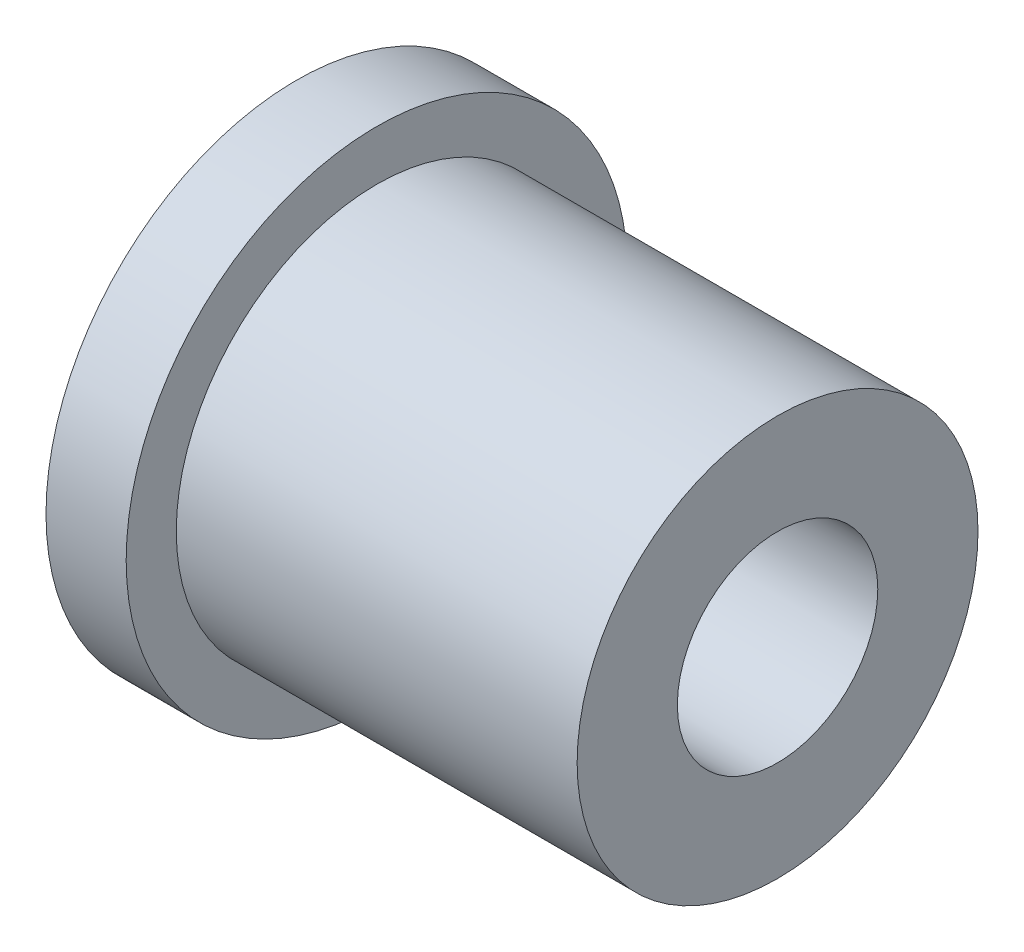
ISO-10303-21;
HEADER;
FILE_DESCRIPTION(('STEP AP214'),'2;1');
FILE_NAME('part.step','',(''),(''),'','','');
FILE_SCHEMA(('AUTOMOTIVE_DESIGN { 1 0 10303 214 1 1 1 1 }'));
ENDSEC;
DATA;
#1=APPLICATION_CONTEXT('core data for automotive mechanical design processes');
#2=APPLICATION_PROTOCOL_DEFINITION('international standard','automotive_design',2000,#1);
#3=PRODUCT_CONTEXT('',#1,'mechanical');
#4=PRODUCT('Part','Part','',(#3));
#5=PRODUCT_RELATED_PRODUCT_CATEGORY('part','',(#4));
#6=PRODUCT_DEFINITION_FORMATION('','',#4);
#7=PRODUCT_DEFINITION_CONTEXT('part definition',#1,'design');
#8=PRODUCT_DEFINITION('design','',#6,#7);
#9=PRODUCT_DEFINITION_SHAPE('','',#8);
#10=(LENGTH_UNIT() NAMED_UNIT(*) SI_UNIT(.MILLI.,.METRE.));
#11=(NAMED_UNIT(*) PLANE_ANGLE_UNIT() SI_UNIT($,.RADIAN.));
#12=(NAMED_UNIT(*) SI_UNIT($,.STERADIAN.) SOLID_ANGLE_UNIT());
#13=UNCERTAINTY_MEASURE_WITH_UNIT(LENGTH_MEASURE(1.E-05),#10,'distance_accuracy_value','');
#14=(GEOMETRIC_REPRESENTATION_CONTEXT(3) GLOBAL_UNCERTAINTY_ASSIGNED_CONTEXT((#13)) GLOBAL_UNIT_ASSIGNED_CONTEXT((#10,
#11,#12)) REPRESENTATION_CONTEXT('',''));
#15=CARTESIAN_POINT('',(0.,0.,0.));
#16=DIRECTION('',(0.,0.,1.));
#17=DIRECTION('',(1.,0.,0.));
#18=AXIS2_PLACEMENT_3D('',#15,#16,#17);
#19=CARTESIAN_POINT('',(0.,0.,0.));
#20=DIRECTION('',(-1.,0.,0.));
#21=DIRECTION('',(0.,0.,1.));
#22=AXIS2_PLACEMENT_3D('',#19,#20,#21);
#23=CYLINDRICAL_SURFACE('',#22,7.9375);
#24=CARTESIAN_POINT('',(0.,0.,0.));
#25=DIRECTION('',(-1.,0.,0.));
#26=DIRECTION('',(0.,0.,1.));
#27=AXIS2_PLACEMENT_3D('',#24,#25,#26);
#28=CIRCLE('',#27,7.9375);
#29=CARTESIAN_POINT('',(0.,0.,7.9375));
#30=VERTEX_POINT('',#29);
#31=EDGE_CURVE('E70',#30,#30,#28,.T.);
#32=ORIENTED_EDGE('',*,*,#31,.F.);
#33=EDGE_LOOP('',(#32));
#34=FACE_BOUND('',#33,.T.);
#35=CARTESIAN_POINT('',(2.54,0.,0.));
#36=DIRECTION('',(-1.,0.,0.));
#37=DIRECTION('',(0.,0.,1.));
#38=AXIS2_PLACEMENT_3D('',#35,#36,#37);
#39=CIRCLE('',#38,7.9375);
#40=CARTESIAN_POINT('',(2.54,0.,7.9375));
#41=VERTEX_POINT('',#40);
#42=EDGE_CURVE('E10',#41,#41,#39,.T.);
#43=ORIENTED_EDGE('',*,*,#42,.T.);
#44=EDGE_LOOP('',(#43));
#45=FACE_BOUND('',#44,.T.);
#46=ADVANCED_FACE('F43',(#34,#45),#23,.T.);
#47=CARTESIAN_POINT('',(2.54,7.9375,0.));
#48=DIRECTION('',(-1.,0.,0.));
#49=DIRECTION('',(0.,0.,1.));
#50=AXIS2_PLACEMENT_3D('',#47,#48,#49);
#51=PLANE('',#50);
#52=ORIENTED_EDGE('',*,*,#42,.F.);
#53=EDGE_LOOP('',(#52));
#54=FACE_BOUND('',#53,.T.);
#55=CARTESIAN_POINT('',(2.54,0.,0.));
#56=DIRECTION('',(-1.,0.,0.));
#57=DIRECTION('',(0.,0.,1.));
#58=AXIS2_PLACEMENT_3D('',#55,#56,#57);
#59=CIRCLE('',#58,6.35);
#60=CARTESIAN_POINT('',(2.54,0.,6.35));
#61=VERTEX_POINT('',#60);
#62=EDGE_CURVE('E50',#61,#61,#59,.T.);
#63=ORIENTED_EDGE('',*,*,#62,.T.);
#64=EDGE_LOOP('',(#63));
#65=FACE_BOUND('',#64,.T.);
#66=ADVANCED_FACE('F78',(#54,#65),#51,.F.);
#67=CARTESIAN_POINT('',(0.,0.,0.));
#68=DIRECTION('',(-1.,0.,0.));
#69=DIRECTION('',(0.,0.,1.));
#70=AXIS2_PLACEMENT_3D('',#67,#68,#69);
#71=CYLINDRICAL_SURFACE('',#70,6.35);
#72=ORIENTED_EDGE('',*,*,#62,.F.);
#73=EDGE_LOOP('',(#72));
#74=FACE_BOUND('',#73,.T.);
#75=CARTESIAN_POINT('',(15.24,0.,0.));
#76=DIRECTION('',(-1.,0.,0.));
#77=DIRECTION('',(0.,0.,1.));
#78=AXIS2_PLACEMENT_3D('',#75,#76,#77);
#79=CIRCLE('',#78,6.35);
#80=CARTESIAN_POINT('',(15.24,0.,6.35));
#81=VERTEX_POINT('',#80);
#82=EDGE_CURVE('E55',#81,#81,#79,.T.);
#83=ORIENTED_EDGE('',*,*,#82,.T.);
#84=EDGE_LOOP('',(#83));
#85=FACE_BOUND('',#84,.T.);
#86=ADVANCED_FACE('F82',(#74,#85),#71,.T.);
#87=CARTESIAN_POINT('',(15.24,6.35,0.));
#88=DIRECTION('',(-1.,0.,0.));
#89=DIRECTION('',(0.,0.,1.));
#90=AXIS2_PLACEMENT_3D('',#87,#88,#89);
#91=PLANE('',#90);
#92=ORIENTED_EDGE('',*,*,#82,.F.);
#93=EDGE_LOOP('',(#92));
#94=FACE_BOUND('',#93,.T.);
#95=CARTESIAN_POINT('',(15.24,0.,0.));
#96=DIRECTION('',(-1.,0.,0.));
#97=DIRECTION('',(0.,0.,1.));
#98=AXIS2_PLACEMENT_3D('',#95,#96,#97);
#99=CIRCLE('',#98,3.175);
#100=CARTESIAN_POINT('',(15.24,0.,3.175));
#101=VERTEX_POINT('',#100);
#102=EDGE_CURVE('E60',#101,#101,#99,.T.);
#103=ORIENTED_EDGE('',*,*,#102,.T.);
#104=EDGE_LOOP('',(#103));
#105=FACE_BOUND('',#104,.T.);
#106=ADVANCED_FACE('F87',(#94,#105),#91,.F.);
#107=CARTESIAN_POINT('',(0.,0.,0.));
#108=DIRECTION('',(-1.,0.,0.));
#109=DIRECTION('',(0.,0.,1.));
#110=AXIS2_PLACEMENT_3D('',#107,#108,#109);
#111=CYLINDRICAL_SURFACE('',#110,3.175);
#112=ORIENTED_EDGE('',*,*,#102,.F.);
#113=EDGE_LOOP('',(#112));
#114=FACE_BOUND('',#113,.T.);
#115=CARTESIAN_POINT('',(0.,0.,0.));
#116=DIRECTION('',(-1.,0.,0.));
#117=DIRECTION('',(0.,0.,1.));
#118=AXIS2_PLACEMENT_3D('',#115,#116,#117);
#119=CIRCLE('',#118,3.175);
#120=CARTESIAN_POINT('',(0.,0.,3.175));
#121=VERTEX_POINT('',#120);
#122=EDGE_CURVE('E66',#121,#121,#119,.T.);
#123=ORIENTED_EDGE('',*,*,#122,.T.);
#124=EDGE_LOOP('',(#123));
#125=FACE_BOUND('',#124,.T.);
#126=ADVANCED_FACE('F93',(#114,#125),#111,.F.);
#127=CARTESIAN_POINT('',(0.,3.175,0.));
#128=DIRECTION('',(1.,0.,0.));
#129=DIRECTION('',(0.,0.,-1.));
#130=AXIS2_PLACEMENT_3D('',#127,#128,#129);
#131=PLANE('',#130);
#132=ORIENTED_EDGE('',*,*,#122,.F.);
#133=EDGE_LOOP('',(#132));
#134=FACE_BOUND('',#133,.T.);
#135=ORIENTED_EDGE('',*,*,#31,.T.);
#136=EDGE_LOOP('',(#135));
#137=FACE_BOUND('',#136,.T.);
#138=ADVANCED_FACE('F75',(#134,#137),#131,.F.);
#139=CLOSED_SHELL('',(#46,#66,#86,#106,#126,#138));
#140=MANIFOLD_SOLID_BREP('B2',#139);
#141=ADVANCED_BREP_SHAPE_REPRESENTATION('',(#18,#140),#14);
#142=SHAPE_DEFINITION_REPRESENTATION(#9,#141);
ENDSEC;
END-ISO-10303-21;
